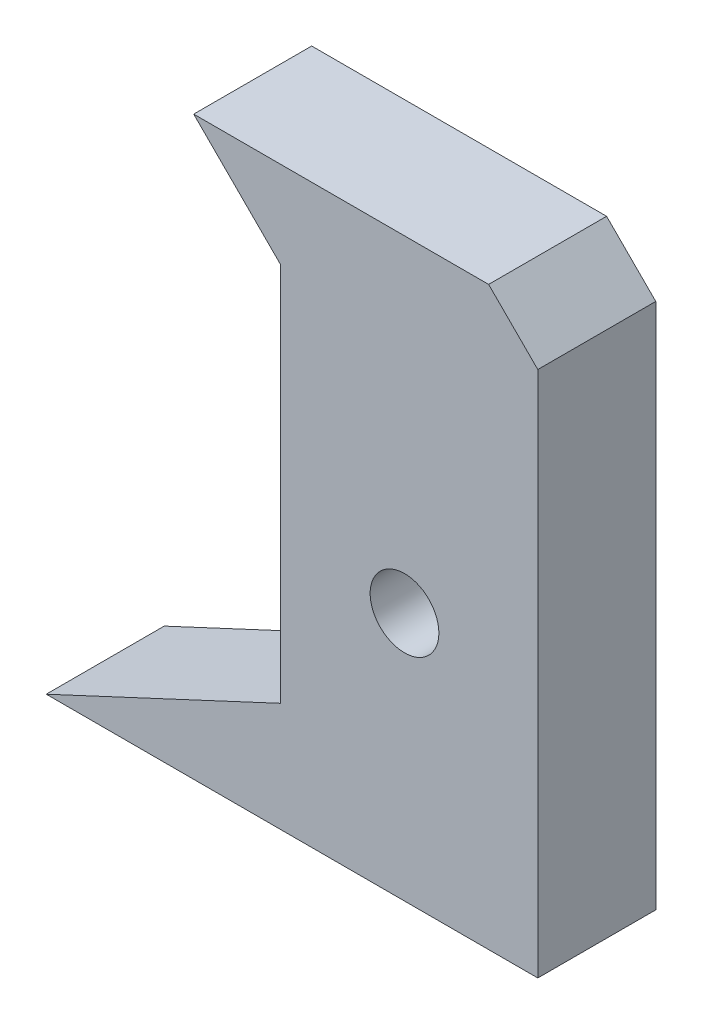
ISO-10303-21;
HEADER;
FILE_DESCRIPTION(('STEP AP214'),'2;1');
FILE_NAME('part.step','',(''),(''),'','','');
FILE_SCHEMA(('AUTOMOTIVE_DESIGN { 1 0 10303 214 1 1 1 1 }'));
ENDSEC;
DATA;
#1=APPLICATION_CONTEXT('core data for automotive mechanical design processes');
#2=APPLICATION_PROTOCOL_DEFINITION('international standard','automotive_design',2000,#1);
#3=PRODUCT_CONTEXT('',#1,'mechanical');
#4=PRODUCT('Part','Part','',(#3));
#5=PRODUCT_RELATED_PRODUCT_CATEGORY('part','',(#4));
#6=PRODUCT_DEFINITION_FORMATION('','',#4);
#7=PRODUCT_DEFINITION_CONTEXT('part definition',#1,'design');
#8=PRODUCT_DEFINITION('design','',#6,#7);
#9=PRODUCT_DEFINITION_SHAPE('','',#8);
#10=(LENGTH_UNIT() NAMED_UNIT(*) SI_UNIT(.MILLI.,.METRE.));
#11=(NAMED_UNIT(*) PLANE_ANGLE_UNIT() SI_UNIT($,.RADIAN.));
#12=(NAMED_UNIT(*) SI_UNIT($,.STERADIAN.) SOLID_ANGLE_UNIT());
#13=UNCERTAINTY_MEASURE_WITH_UNIT(LENGTH_MEASURE(1.E-05),#10,'distance_accuracy_value','');
#14=(GEOMETRIC_REPRESENTATION_CONTEXT(3) GLOBAL_UNCERTAINTY_ASSIGNED_CONTEXT((#13)) GLOBAL_UNIT_ASSIGNED_CONTEXT((#10,
#11,#12)) REPRESENTATION_CONTEXT('',''));
#15=CARTESIAN_POINT('',(0.,0.,0.));
#16=DIRECTION('',(0.,0.,1.));
#17=DIRECTION('',(1.,0.,0.));
#18=AXIS2_PLACEMENT_3D('',#15,#16,#17);
#19=CARTESIAN_POINT('',(-50.,0.,12.));
#20=DIRECTION('',(0.,1.,0.));
#21=DIRECTION('',(0.,0.,1.));
#22=AXIS2_PLACEMENT_3D('',#19,#20,#21);
#23=PLANE('',#22);
#24=DIRECTION('',(1.,0.,0.));
#25=VECTOR('',#24,1.);
#26=CARTESIAN_POINT('',(-50.,0.,0.));
#27=LINE('',#26,#25);
#28=CARTESIAN_POINT('',(-50.,0.,0.));
#29=VERTEX_POINT('',#28);
#30=CARTESIAN_POINT('',(0.,0.,0.));
#31=VERTEX_POINT('',#30);
#32=EDGE_CURVE('E114',#29,#31,#27,.T.);
#33=ORIENTED_EDGE('',*,*,#32,.T.);
#34=DIRECTION('',(0.,0.,-1.));
#35=VECTOR('',#34,1.);
#36=CARTESIAN_POINT('',(0.,0.,12.));
#37=LINE('',#36,#35);
#38=CARTESIAN_POINT('',(0.,0.,12.));
#39=VERTEX_POINT('',#38);
#40=EDGE_CURVE('E97',#39,#31,#37,.T.);
#41=ORIENTED_EDGE('',*,*,#40,.F.);
#42=DIRECTION('',(1.,0.,0.));
#43=VECTOR('',#42,1.);
#44=CARTESIAN_POINT('',(-50.,0.,12.));
#45=LINE('',#44,#43);
#46=CARTESIAN_POINT('',(-50.,0.,12.));
#47=VERTEX_POINT('',#46);
#48=EDGE_CURVE('E102',#47,#39,#45,.T.);
#49=ORIENTED_EDGE('',*,*,#48,.F.);
#50=DIRECTION('',(0.,0.,-1.));
#51=VECTOR('',#50,1.);
#52=CARTESIAN_POINT('',(-50.,0.,12.));
#53=LINE('',#52,#51);
#54=EDGE_CURVE('E130',#47,#29,#53,.T.);
#55=ORIENTED_EDGE('',*,*,#54,.T.);
#56=EDGE_LOOP('',(#33,#41,#49,#55));
#57=FACE_BOUND('',#56,.T.);
#58=ADVANCED_FACE('F37',(#57),#23,.F.);
#59=CARTESIAN_POINT('',(0.,0.,12.));
#60=DIRECTION('',(-1.,0.,0.));
#61=DIRECTION('',(0.,0.,1.));
#62=AXIS2_PLACEMENT_3D('',#59,#60,#61);
#63=PLANE('',#62);
#64=DIRECTION('',(0.,1.,0.));
#65=VECTOR('',#64,1.);
#66=CARTESIAN_POINT('',(0.,0.,0.));
#67=LINE('',#66,#65);
#68=CARTESIAN_POINT('',(0.,53.6,0.));
#69=VERTEX_POINT('',#68);
#70=EDGE_CURVE('E139',#31,#69,#67,.T.);
#71=ORIENTED_EDGE('',*,*,#70,.T.);
#72=DIRECTION('',(0.,0.,1.));
#73=VECTOR('',#72,1.);
#74=CARTESIAN_POINT('',(0.,53.6,12.));
#75=LINE('',#74,#73);
#76=CARTESIAN_POINT('',(0.,53.6,12.));
#77=VERTEX_POINT('',#76);
#78=EDGE_CURVE('E46',#69,#77,#75,.T.);
#79=ORIENTED_EDGE('',*,*,#78,.T.);
#80=DIRECTION('',(0.,1.,0.));
#81=VECTOR('',#80,1.);
#82=CARTESIAN_POINT('',(0.,0.,12.));
#83=LINE('',#82,#81);
#84=EDGE_CURVE('E93',#39,#77,#83,.T.);
#85=ORIENTED_EDGE('',*,*,#84,.F.);
#86=ORIENTED_EDGE('',*,*,#40,.T.);
#87=EDGE_LOOP('',(#71,#79,#85,#86));
#88=FACE_BOUND('',#87,.T.);
#89=ADVANCED_FACE('F95',(#88),#63,.F.);
#90=CARTESIAN_POINT('',(0.,58.6,12.));
#91=DIRECTION('',(0.,-1.,0.));
#92=DIRECTION('',(1.,0.,0.));
#93=AXIS2_PLACEMENT_3D('',#90,#91,#92);
#94=PLANE('',#93);
#95=DIRECTION('',(-1.,0.,0.));
#96=VECTOR('',#95,1.);
#97=CARTESIAN_POINT('',(0.,58.6,12.));
#98=LINE('',#97,#96);
#99=CARTESIAN_POINT('',(-5.,58.6,12.));
#100=VERTEX_POINT('',#99);
#101=CARTESIAN_POINT('',(-35.,58.6,12.));
#102=VERTEX_POINT('',#101);
#103=EDGE_CURVE('E101',#100,#102,#98,.T.);
#104=ORIENTED_EDGE('',*,*,#103,.F.);
#105=DIRECTION('',(0.,0.,-1.));
#106=VECTOR('',#105,1.);
#107=CARTESIAN_POINT('',(-5.,58.6,12.));
#108=LINE('',#107,#106);
#109=CARTESIAN_POINT('',(-5.,58.6,0.));
#110=VERTEX_POINT('',#109);
#111=EDGE_CURVE('E115',#100,#110,#108,.T.);
#112=ORIENTED_EDGE('',*,*,#111,.T.);
#113=DIRECTION('',(-1.,0.,0.));
#114=VECTOR('',#113,1.);
#115=CARTESIAN_POINT('',(0.,58.6,0.));
#116=LINE('',#115,#114);
#117=CARTESIAN_POINT('',(-35.,58.6,0.));
#118=VERTEX_POINT('',#117);
#119=EDGE_CURVE('E137',#110,#118,#116,.T.);
#120=ORIENTED_EDGE('',*,*,#119,.T.);
#121=DIRECTION('',(0.,0.,-1.));
#122=VECTOR('',#121,1.);
#123=CARTESIAN_POINT('',(-35.,58.6,12.));
#124=LINE('',#123,#122);
#125=EDGE_CURVE('E116',#102,#118,#124,.T.);
#126=ORIENTED_EDGE('',*,*,#125,.F.);
#127=EDGE_LOOP('',(#104,#112,#120,#126));
#128=FACE_BOUND('',#127,.T.);
#129=ADVANCED_FACE('F178',(#128),#94,.F.);
#130=CARTESIAN_POINT('',(-35.,58.6,12.));
#131=DIRECTION('',(0.707106781186543,0.707106781186552,0.));
#132=DIRECTION('',(-0.707106781186552,0.707106781186543,0.));
#133=AXIS2_PLACEMENT_3D('',#130,#131,#132);
#134=PLANE('',#133);
#135=DIRECTION('',(0.707106781186552,-0.707106781186543,0.));
#136=VECTOR('',#135,1.);
#137=CARTESIAN_POINT('',(-35.,58.6,0.));
#138=LINE('',#137,#136);
#139=CARTESIAN_POINT('',(-26.1959731823435,49.7959731823436,0.));
#140=VERTEX_POINT('',#139);
#141=EDGE_CURVE('E135',#118,#140,#138,.T.);
#142=ORIENTED_EDGE('',*,*,#141,.T.);
#143=DIRECTION('',(0.,0.,-1.));
#144=VECTOR('',#143,1.);
#145=CARTESIAN_POINT('',(-26.1959731823435,49.7959731823436,12.));
#146=LINE('',#145,#144);
#147=CARTESIAN_POINT('',(-26.1959731823435,49.7959731823436,12.));
#148=VERTEX_POINT('',#147);
#149=EDGE_CURVE('E121',#148,#140,#146,.T.);
#150=ORIENTED_EDGE('',*,*,#149,.F.);
#151=DIRECTION('',(0.707106781186552,-0.707106781186543,0.));
#152=VECTOR('',#151,1.);
#153=CARTESIAN_POINT('',(-35.,58.6,12.));
#154=LINE('',#153,#152);
#155=EDGE_CURVE('E146',#102,#148,#154,.T.);
#156=ORIENTED_EDGE('',*,*,#155,.F.);
#157=ORIENTED_EDGE('',*,*,#125,.T.);
#158=EDGE_LOOP('',(#142,#150,#156,#157));
#159=FACE_BOUND('',#158,.T.);
#160=ADVANCED_FACE('F183',(#159),#134,.F.);
#161=CARTESIAN_POINT('',(-26.1959731823435,49.7959731823436,12.));
#162=DIRECTION('',(1.,0.,0.));
#163=DIRECTION('',(0.,1.,0.));
#164=AXIS2_PLACEMENT_3D('',#161,#162,#163);
#165=PLANE('',#164);
#166=DIRECTION('',(0.,-1.,0.));
#167=VECTOR('',#166,1.);
#168=CARTESIAN_POINT('',(-26.1959731823435,49.7959731823436,0.));
#169=LINE('',#168,#167);
#170=CARTESIAN_POINT('',(-26.1959731823435,11.1,0.));
#171=VERTEX_POINT('',#170);
#172=EDGE_CURVE('E133',#140,#171,#169,.T.);
#173=ORIENTED_EDGE('',*,*,#172,.T.);
#174=DIRECTION('',(0.,0.,-1.));
#175=VECTOR('',#174,1.);
#176=CARTESIAN_POINT('',(-26.1959731823435,11.1,12.));
#177=LINE('',#176,#175);
#178=CARTESIAN_POINT('',(-26.1959731823435,11.1,12.));
#179=VERTEX_POINT('',#178);
#180=EDGE_CURVE('E127',#179,#171,#177,.T.);
#181=ORIENTED_EDGE('',*,*,#180,.F.);
#182=DIRECTION('',(0.,-1.,0.));
#183=VECTOR('',#182,1.);
#184=CARTESIAN_POINT('',(-26.1959731823435,49.7959731823436,12.));
#185=LINE('',#184,#183);
#186=EDGE_CURVE('E144',#148,#179,#185,.T.);
#187=ORIENTED_EDGE('',*,*,#186,.F.);
#188=ORIENTED_EDGE('',*,*,#149,.T.);
#189=EDGE_LOOP('',(#173,#181,#187,#188));
#190=FACE_BOUND('',#189,.T.);
#191=ADVANCED_FACE('F171',(#190),#165,.F.);
#192=CARTESIAN_POINT('',(-26.1959731823435,11.1,12.));
#193=DIRECTION('',(0.422618261740694,-0.906307787036652,0.));
#194=DIRECTION('',(0.906307787036653,0.422618261740694,0.));
#195=AXIS2_PLACEMENT_3D('',#192,#193,#194);
#196=PLANE('',#195);
#197=DIRECTION('',(-0.906307787036653,-0.422618261740694,0.));
#198=VECTOR('',#197,1.);
#199=CARTESIAN_POINT('',(-26.1959731823435,11.1,0.));
#200=LINE('',#199,#198);
#201=EDGE_CURVE('E111',#171,#29,#200,.T.);
#202=ORIENTED_EDGE('',*,*,#201,.T.);
#203=ORIENTED_EDGE('',*,*,#54,.F.);
#204=DIRECTION('',(-0.906307787036653,-0.422618261740694,0.));
#205=VECTOR('',#204,1.);
#206=CARTESIAN_POINT('',(-26.1959731823435,11.1,12.));
#207=LINE('',#206,#205);
#208=EDGE_CURVE('E107',#179,#47,#207,.T.);
#209=ORIENTED_EDGE('',*,*,#208,.F.);
#210=ORIENTED_EDGE('',*,*,#180,.T.);
#211=EDGE_LOOP('',(#202,#203,#209,#210));
#212=FACE_BOUND('',#211,.T.);
#213=ADVANCED_FACE('F164',(#212),#196,.F.);
#214=CARTESIAN_POINT('',(0.,0.,12.));
#215=DIRECTION('',(0.,0.,1.));
#216=DIRECTION('',(1.,0.,0.));
#217=AXIS2_PLACEMENT_3D('',#214,#215,#216);
#218=PLANE('',#217);
#219=CARTESIAN_POINT('',(-13.5566195893707,25.36,12.));
#220=DIRECTION('',(0.,0.,1.));
#221=DIRECTION('',(1.,0.,0.));
#222=AXIS2_PLACEMENT_3D('',#219,#220,#221);
#223=CIRCLE('',#222,3.495);
#224=CARTESIAN_POINT('',(-10.0616195893707,25.36,12.));
#225=VERTEX_POINT('',#224);
#226=EDGE_CURVE('E149',#225,#225,#223,.T.);
#227=ORIENTED_EDGE('',*,*,#226,.F.);
#228=EDGE_LOOP('',(#227));
#229=FACE_BOUND('',#228,.T.);
#230=ORIENTED_EDGE('',*,*,#84,.T.);
#231=DIRECTION('',(0.707106781186547,-0.707106781186549,0.));
#232=VECTOR('',#231,1.);
#233=CARTESIAN_POINT('',(26.8,26.7999999999999,12.));
#234=LINE('',#233,#232);
#235=EDGE_CURVE('E11',#77,#100,#234,.F.);
#236=ORIENTED_EDGE('',*,*,#235,.T.);
#237=ORIENTED_EDGE('',*,*,#103,.T.);
#238=ORIENTED_EDGE('',*,*,#155,.T.);
#239=ORIENTED_EDGE('',*,*,#186,.T.);
#240=ORIENTED_EDGE('',*,*,#208,.T.);
#241=ORIENTED_EDGE('',*,*,#48,.T.);
#242=EDGE_LOOP('',(#230,#236,#237,#238,#239,#240,#241));
#243=FACE_BOUND('',#242,.T.);
#244=ADVANCED_FACE('F105',(#229,#243),#218,.T.);
#245=CARTESIAN_POINT('',(0.,0.,0.));
#246=DIRECTION('',(0.,0.,1.));
#247=DIRECTION('',(1.,0.,0.));
#248=AXIS2_PLACEMENT_3D('',#245,#246,#247);
#249=PLANE('',#248);
#250=CARTESIAN_POINT('',(-13.5566195893707,25.36,0.));
#251=DIRECTION('',(0.,0.,1.));
#252=DIRECTION('',(1.,0.,0.));
#253=AXIS2_PLACEMENT_3D('',#250,#251,#252);
#254=CIRCLE('',#253,3.495);
#255=CARTESIAN_POINT('',(-10.0616195893707,25.36,0.));
#256=VERTEX_POINT('',#255);
#257=EDGE_CURVE('E142',#256,#256,#254,.T.);
#258=ORIENTED_EDGE('',*,*,#257,.T.);
#259=EDGE_LOOP('',(#258));
#260=FACE_BOUND('',#259,.T.);
#261=ORIENTED_EDGE('',*,*,#119,.F.);
#262=DIRECTION('',(-0.707106781186547,0.707106781186549,0.));
#263=VECTOR('',#262,1.);
#264=CARTESIAN_POINT('',(-5.,58.6,0.));
#265=LINE('',#264,#263);
#266=EDGE_CURVE('E60',#110,#69,#265,.F.);
#267=ORIENTED_EDGE('',*,*,#266,.T.);
#268=ORIENTED_EDGE('',*,*,#70,.F.);
#269=ORIENTED_EDGE('',*,*,#32,.F.);
#270=ORIENTED_EDGE('',*,*,#201,.F.);
#271=ORIENTED_EDGE('',*,*,#172,.F.);
#272=ORIENTED_EDGE('',*,*,#141,.F.);
#273=EDGE_LOOP('',(#261,#267,#268,#269,#270,#271,#272));
#274=FACE_BOUND('',#273,.T.);
#275=ADVANCED_FACE('F155',(#260,#274),#249,.F.);
#276=CARTESIAN_POINT('',(-13.5566195893707,25.36,0.));
#277=DIRECTION('',(0.,0.,1.));
#278=DIRECTION('',(1.,0.,0.));
#279=AXIS2_PLACEMENT_3D('',#276,#277,#278);
#280=CYLINDRICAL_SURFACE('',#279,3.495);
#281=ORIENTED_EDGE('',*,*,#257,.F.);
#282=EDGE_LOOP('',(#281));
#283=FACE_BOUND('',#282,.T.);
#284=ORIENTED_EDGE('',*,*,#226,.T.);
#285=EDGE_LOOP('',(#284));
#286=FACE_BOUND('',#285,.T.);
#287=ADVANCED_FACE('F157',(#283,#286),#280,.F.);
#288=CARTESIAN_POINT('',(-5.,58.6,12.));
#289=DIRECTION('',(-0.707106781186548,-0.707106781186546,0.));
#290=DIRECTION('',(0.,0.,-1.));
#291=AXIS2_PLACEMENT_3D('',#288,#289,#290);
#292=PLANE('',#291);
#293=ORIENTED_EDGE('',*,*,#235,.F.);
#294=ORIENTED_EDGE('',*,*,#78,.F.);
#295=ORIENTED_EDGE('',*,*,#266,.F.);
#296=ORIENTED_EDGE('',*,*,#111,.F.);
#297=EDGE_LOOP('',(#293,#294,#295,#296));
#298=FACE_BOUND('',#297,.T.);
#299=ADVANCED_FACE('F40',(#298),#292,.F.);
#300=CLOSED_SHELL('',(#58,#89,#129,#160,#191,#213,#244,#275,#287,#299));
#301=MANIFOLD_SOLID_BREP('B2',#300);
#302=ADVANCED_BREP_SHAPE_REPRESENTATION('',(#18,#301),#14);
#303=SHAPE_DEFINITION_REPRESENTATION(#9,#302);
ENDSEC;
END-ISO-10303-21;
